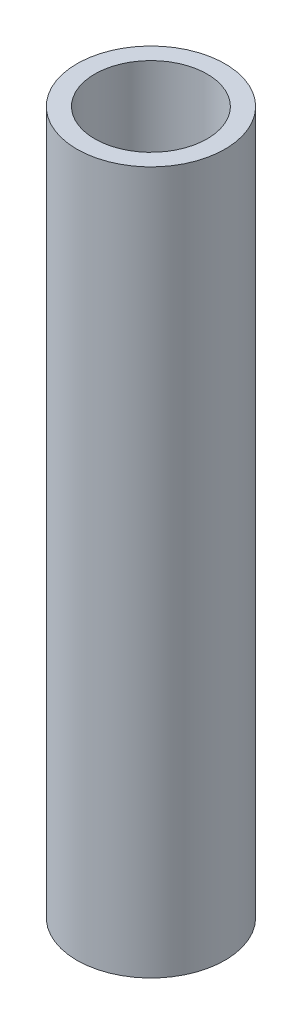
ISO-10303-21;
HEADER;
FILE_DESCRIPTION(('STEP AP214'),'2;1');
FILE_NAME('part.step','',(''),(''),'','','');
FILE_SCHEMA(('AUTOMOTIVE_DESIGN { 1 0 10303 214 1 1 1 1 }'));
ENDSEC;
DATA;
#1=APPLICATION_CONTEXT('core data for automotive mechanical design processes');
#2=APPLICATION_PROTOCOL_DEFINITION('international standard','automotive_design',2000,#1);
#3=PRODUCT_CONTEXT('',#1,'mechanical');
#4=PRODUCT('Part','Part','',(#3));
#5=PRODUCT_RELATED_PRODUCT_CATEGORY('part','',(#4));
#6=PRODUCT_DEFINITION_FORMATION('','',#4);
#7=PRODUCT_DEFINITION_CONTEXT('part definition',#1,'design');
#8=PRODUCT_DEFINITION('design','',#6,#7);
#9=PRODUCT_DEFINITION_SHAPE('','',#8);
#10=(LENGTH_UNIT() NAMED_UNIT(*) SI_UNIT(.MILLI.,.METRE.));
#11=(NAMED_UNIT(*) PLANE_ANGLE_UNIT() SI_UNIT($,.RADIAN.));
#12=(NAMED_UNIT(*) SI_UNIT($,.STERADIAN.) SOLID_ANGLE_UNIT());
#13=UNCERTAINTY_MEASURE_WITH_UNIT(LENGTH_MEASURE(1.E-05),#10,'distance_accuracy_value','');
#14=(GEOMETRIC_REPRESENTATION_CONTEXT(3) GLOBAL_UNCERTAINTY_ASSIGNED_CONTEXT((#13)) GLOBAL_UNIT_ASSIGNED_CONTEXT((#10,
#11,#12)) REPRESENTATION_CONTEXT('',''));
#15=CARTESIAN_POINT('',(0.,0.,0.));
#16=DIRECTION('',(0.,0.,1.));
#17=DIRECTION('',(1.,0.,0.));
#18=AXIS2_PLACEMENT_3D('',#15,#16,#17);
#19=CARTESIAN_POINT('',(0.,10.,0.));
#20=DIRECTION('',(0.,1.,0.));
#21=DIRECTION('',(0.,0.,1.));
#22=AXIS2_PLACEMENT_3D('',#19,#20,#21);
#23=PLANE('',#22);
#24=CARTESIAN_POINT('',(0.,10.,0.));
#25=DIRECTION('',(0.,1.,0.));
#26=DIRECTION('',(0.,0.,1.));
#27=AXIS2_PLACEMENT_3D('',#24,#25,#26);
#28=CIRCLE('',#27,1.054);
#29=CARTESIAN_POINT('',(0.,10.,1.054));
#30=VERTEX_POINT('',#29);
#31=EDGE_CURVE('E10',#30,#30,#28,.T.);
#32=ORIENTED_EDGE('',*,*,#31,.T.);
#33=EDGE_LOOP('',(#32));
#34=FACE_BOUND('',#33,.T.);
#35=CARTESIAN_POINT('',(0.,10.,0.));
#36=DIRECTION('',(0.,1.,0.));
#37=DIRECTION('',(0.,0.,1.));
#38=AXIS2_PLACEMENT_3D('',#35,#36,#37);
#39=CIRCLE('',#38,0.8);
#40=CARTESIAN_POINT('',(0.,10.,0.8));
#41=VERTEX_POINT('',#40);
#42=EDGE_CURVE('E42',#41,#41,#39,.T.);
#43=ORIENTED_EDGE('',*,*,#42,.F.);
#44=EDGE_LOOP('',(#43));
#45=FACE_BOUND('',#44,.T.);
#46=ADVANCED_FACE('F31',(#34,#45),#23,.T.);
#47=CARTESIAN_POINT('',(0.,0.,0.));
#48=DIRECTION('',(0.,1.,0.));
#49=DIRECTION('',(0.,0.,1.));
#50=AXIS2_PLACEMENT_3D('',#47,#48,#49);
#51=PLANE('',#50);
#52=CARTESIAN_POINT('',(0.,0.,0.));
#53=DIRECTION('',(0.,1.,0.));
#54=DIRECTION('',(0.,0.,1.));
#55=AXIS2_PLACEMENT_3D('',#52,#53,#54);
#56=CIRCLE('',#55,1.054);
#57=CARTESIAN_POINT('',(0.,0.,1.054));
#58=VERTEX_POINT('',#57);
#59=EDGE_CURVE('E35',#58,#58,#56,.T.);
#60=ORIENTED_EDGE('',*,*,#59,.F.);
#61=EDGE_LOOP('',(#60));
#62=FACE_BOUND('',#61,.T.);
#63=CARTESIAN_POINT('',(0.,0.,0.));
#64=DIRECTION('',(0.,1.,0.));
#65=DIRECTION('',(0.,0.,1.));
#66=AXIS2_PLACEMENT_3D('',#63,#64,#65);
#67=CIRCLE('',#66,0.8);
#68=CARTESIAN_POINT('',(0.,0.,0.8));
#69=VERTEX_POINT('',#68);
#70=EDGE_CURVE('E44',#69,#69,#67,.T.);
#71=ORIENTED_EDGE('',*,*,#70,.T.);
#72=EDGE_LOOP('',(#71));
#73=FACE_BOUND('',#72,.T.);
#74=ADVANCED_FACE('F54',(#62,#73),#51,.F.);
#75=CARTESIAN_POINT('',(0.,10.,0.));
#76=DIRECTION('',(0.,-1.,0.));
#77=DIRECTION('',(0.,0.,-1.));
#78=AXIS2_PLACEMENT_3D('',#75,#76,#77);
#79=CYLINDRICAL_SURFACE('',#78,1.054);
#80=ORIENTED_EDGE('',*,*,#31,.F.);
#81=EDGE_LOOP('',(#80));
#82=FACE_BOUND('',#81,.T.);
#83=ORIENTED_EDGE('',*,*,#59,.T.);
#84=EDGE_LOOP('',(#83));
#85=FACE_BOUND('',#84,.T.);
#86=ADVANCED_FACE('F33',(#82,#85),#79,.T.);
#87=CARTESIAN_POINT('',(0.,10.,0.));
#88=DIRECTION('',(0.,-1.,0.));
#89=DIRECTION('',(0.,0.,-1.));
#90=AXIS2_PLACEMENT_3D('',#87,#88,#89);
#91=CYLINDRICAL_SURFACE('',#90,0.8);
#92=ORIENTED_EDGE('',*,*,#42,.T.);
#93=EDGE_LOOP('',(#92));
#94=FACE_BOUND('',#93,.T.);
#95=ORIENTED_EDGE('',*,*,#70,.F.);
#96=EDGE_LOOP('',(#95));
#97=FACE_BOUND('',#96,.T.);
#98=ADVANCED_FACE('F50',(#94,#97),#91,.F.);
#99=CLOSED_SHELL('',(#46,#74,#86,#98));
#100=MANIFOLD_SOLID_BREP('B2',#99);
#101=ADVANCED_BREP_SHAPE_REPRESENTATION('',(#18,#100),#14);
#102=SHAPE_DEFINITION_REPRESENTATION(#9,#101);
ENDSEC;
END-ISO-10303-21;
